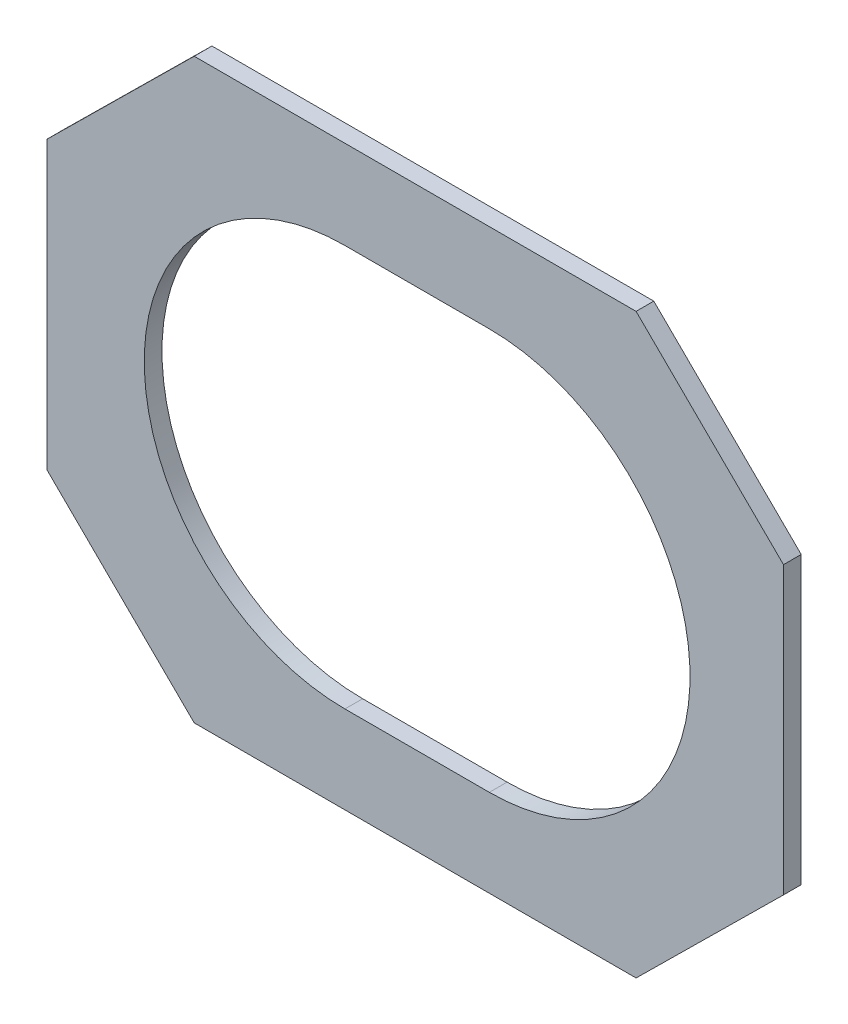
ISO-10303-21;
HEADER;
FILE_DESCRIPTION(('STEP AP214'),'2;1');
FILE_NAME('part.step','',(''),(''),'','','');
FILE_SCHEMA(('AUTOMOTIVE_DESIGN { 1 0 10303 214 1 1 1 1 }'));
ENDSEC;
DATA;
#1=APPLICATION_CONTEXT('core data for automotive mechanical design processes');
#2=APPLICATION_PROTOCOL_DEFINITION('international standard','automotive_design',2000,#1);
#3=PRODUCT_CONTEXT('',#1,'mechanical');
#4=PRODUCT('Part','Part','',(#3));
#5=PRODUCT_RELATED_PRODUCT_CATEGORY('part','',(#4));
#6=PRODUCT_DEFINITION_FORMATION('','',#4);
#7=PRODUCT_DEFINITION_CONTEXT('part definition',#1,'design');
#8=PRODUCT_DEFINITION('design','',#6,#7);
#9=PRODUCT_DEFINITION_SHAPE('','',#8);
#10=(LENGTH_UNIT() NAMED_UNIT(*) SI_UNIT(.MILLI.,.METRE.));
#11=(NAMED_UNIT(*) PLANE_ANGLE_UNIT() SI_UNIT($,.RADIAN.));
#12=(NAMED_UNIT(*) SI_UNIT($,.STERADIAN.) SOLID_ANGLE_UNIT());
#13=UNCERTAINTY_MEASURE_WITH_UNIT(LENGTH_MEASURE(1.E-05),#10,'distance_accuracy_value','');
#14=(GEOMETRIC_REPRESENTATION_CONTEXT(3) GLOBAL_UNCERTAINTY_ASSIGNED_CONTEXT((#13)) GLOBAL_UNIT_ASSIGNED_CONTEXT((#10,
#11,#12)) REPRESENTATION_CONTEXT('',''));
#15=CARTESIAN_POINT('',(0.,0.,0.));
#16=DIRECTION('',(0.,0.,1.));
#17=DIRECTION('',(1.,0.,0.));
#18=AXIS2_PLACEMENT_3D('',#15,#16,#17);
#19=CARTESIAN_POINT('',(0.00469876322514,0.001937867524166,0.1));
#20=DIRECTION('',(0.,0.,1.));
#21=DIRECTION('',(1.,0.,0.));
#22=AXIS2_PLACEMENT_3D('',#19,#20,#21);
#23=PLANE('',#22);
#24=CARTESIAN_POINT('',(-0.396225,0.,0.1));
#25=DIRECTION('',(0.,0.,1.));
#26=DIRECTION('',(1.,0.,0.));
#27=AXIS2_PLACEMENT_3D('',#24,#25,#26);
#28=CIRCLE('',#27,1.133129797124);
#29=CARTESIAN_POINT('',(-0.396225,1.133129797124,0.1));
#30=VERTEX_POINT('',#29);
#31=CARTESIAN_POINT('',(-0.396225,-1.133129797124,0.1));
#32=VERTEX_POINT('',#31);
#33=EDGE_CURVE('E244',#30,#32,#28,.T.);
#34=ORIENTED_EDGE('',*,*,#33,.F.);
#35=DIRECTION('',(-1.,0.,0.));
#36=VECTOR('',#35,1.);
#37=CARTESIAN_POINT('',(0.419316,1.133129797124,0.1));
#38=LINE('',#37,#36);
#39=CARTESIAN_POINT('',(0.419316,1.133129797124,0.1));
#40=VERTEX_POINT('',#39);
#41=EDGE_CURVE('E25',#40,#30,#38,.T.);
#42=ORIENTED_EDGE('',*,*,#41,.F.);
#43=CARTESIAN_POINT('',(0.419316,0.,0.1));
#44=DIRECTION('',(0.,0.,1.));
#45=DIRECTION('',(1.,0.,0.));
#46=AXIS2_PLACEMENT_3D('',#43,#44,#45);
#47=CIRCLE('',#46,1.133129797124);
#48=CARTESIAN_POINT('',(0.419316,-1.133129797124,0.1));
#49=VERTEX_POINT('',#48);
#50=EDGE_CURVE('E262',#49,#40,#47,.T.);
#51=ORIENTED_EDGE('',*,*,#50,.F.);
#52=DIRECTION('',(1.,0.,0.));
#53=VECTOR('',#52,1.);
#54=CARTESIAN_POINT('',(-0.396225,-1.133129797124,0.1));
#55=LINE('',#54,#53);
#56=EDGE_CURVE('E240',#32,#49,#55,.T.);
#57=ORIENTED_EDGE('',*,*,#56,.F.);
#58=EDGE_LOOP('',(#34,#42,#51,#57));
#59=FACE_BOUND('',#58,.T.);
#60=DIRECTION('',(0.,-1.,0.));
#61=VECTOR('',#60,1.);
#62=CARTESIAN_POINT('',(-2.079775000002,0.8107124,0.1));
#63=LINE('',#62,#61);
#64=CARTESIAN_POINT('',(-2.079775000002,0.8107124,0.1));
#65=VERTEX_POINT('',#64);
#66=CARTESIAN_POINT('',(-2.079775000002,-0.804304199997,0.1));
#67=VERTEX_POINT('',#66);
#68=EDGE_CURVE('E160',#65,#67,#63,.T.);
#69=ORIENTED_EDGE('',*,*,#68,.T.);
#70=DIRECTION('',(0.711338653803666,-0.70284942882867,0.));
#71=VECTOR('',#70,1.);
#72=CARTESIAN_POINT('',(-2.079775000002,-0.804304199997,0.1));
#73=LINE('',#72,#71);
#74=CARTESIAN_POINT('',(-1.247349,-1.626795899999,0.1));
#75=VERTEX_POINT('',#74);
#76=EDGE_CURVE('E198',#67,#75,#73,.T.);
#77=ORIENTED_EDGE('',*,*,#76,.T.);
#78=DIRECTION('',(1.,0.,0.));
#79=VECTOR('',#78,1.);
#80=CARTESIAN_POINT('',(-1.247349,-1.626795899999,0.1));
#81=LINE('',#80,#79);
#82=CARTESIAN_POINT('',(1.247799,-1.626795899999,0.1));
#83=VERTEX_POINT('',#82);
#84=EDGE_CURVE('E176',#75,#83,#81,.T.);
#85=ORIENTED_EDGE('',*,*,#84,.T.);
#86=DIRECTION('',(0.711338653802178,0.702849428830176,0.));
#87=VECTOR('',#86,1.);
#88=CARTESIAN_POINT('',(1.247799,-1.626795899999,0.1));
#89=LINE('',#88,#87);
#90=CARTESIAN_POINT('',(2.080224999998,-0.804304199997,0.1));
#91=VERTEX_POINT('',#90);
#92=EDGE_CURVE('E216',#83,#91,#89,.T.);
#93=ORIENTED_EDGE('',*,*,#92,.T.);
#94=DIRECTION('',(0.,1.,0.));
#95=VECTOR('',#94,1.);
#96=CARTESIAN_POINT('',(2.080224999998,-0.804304199997,0.1));
#97=LINE('',#96,#95);
#98=CARTESIAN_POINT('',(2.080224999998,0.8107124,0.1));
#99=VERTEX_POINT('',#98);
#100=EDGE_CURVE('E173',#91,#99,#97,.T.);
#101=ORIENTED_EDGE('',*,*,#100,.T.);
#102=DIRECTION('',(-0.711338653802178,0.702849428830176,0.));
#103=VECTOR('',#102,1.);
#104=CARTESIAN_POINT('',(2.080224999998,0.8107124,0.1));
#105=LINE('',#104,#103);
#106=CARTESIAN_POINT('',(1.247799,1.633204100001,0.1));
#107=VERTEX_POINT('',#106);
#108=EDGE_CURVE('E190',#99,#107,#105,.T.);
#109=ORIENTED_EDGE('',*,*,#108,.T.);
#110=DIRECTION('',(-1.,0.,0.));
#111=VECTOR('',#110,1.);
#112=CARTESIAN_POINT('',(1.247799,1.633204100001,0.1));
#113=LINE('',#112,#111);
#114=CARTESIAN_POINT('',(-1.247349,1.633204100001,0.1));
#115=VERTEX_POINT('',#114);
#116=EDGE_CURVE('E144',#107,#115,#113,.T.);
#117=ORIENTED_EDGE('',*,*,#116,.T.);
#118=DIRECTION('',(-0.711338653803666,-0.70284942882867,0.));
#119=VECTOR('',#118,1.);
#120=CARTESIAN_POINT('',(-1.247349,1.633204100001,0.1));
#121=LINE('',#120,#119);
#122=EDGE_CURVE('E143',#115,#65,#121,.T.);
#123=ORIENTED_EDGE('',*,*,#122,.T.);
#124=EDGE_LOOP('',(#69,#77,#85,#93,#101,#109,#117,#123));
#125=FACE_BOUND('',#124,.T.);
#126=ADVANCED_FACE('F17',(#59,#125),#23,.T.);
#127=CARTESIAN_POINT('',(0.00469876322514,0.001937867524166,0.));
#128=DIRECTION('',(0.,0.,1.));
#129=DIRECTION('',(1.,0.,0.));
#130=AXIS2_PLACEMENT_3D('',#127,#128,#129);
#131=PLANE('',#130);
#132=CARTESIAN_POINT('',(-0.396225,0.,0.));
#133=DIRECTION('',(0.,0.,1.));
#134=DIRECTION('',(1.,0.,0.));
#135=AXIS2_PLACEMENT_3D('',#132,#133,#134);
#136=CIRCLE('',#135,1.133129797124);
#137=CARTESIAN_POINT('',(-0.396225,1.133129797124,0.));
#138=VERTEX_POINT('',#137);
#139=CARTESIAN_POINT('',(-0.396225,-1.133129797124,0.));
#140=VERTEX_POINT('',#139);
#141=EDGE_CURVE('E248',#138,#140,#136,.T.);
#142=ORIENTED_EDGE('',*,*,#141,.T.);
#143=DIRECTION('',(1.,0.,0.));
#144=VECTOR('',#143,1.);
#145=CARTESIAN_POINT('',(-0.396225,-1.133129797124,0.));
#146=LINE('',#145,#144);
#147=CARTESIAN_POINT('',(0.419316,-1.133129797124,0.));
#148=VERTEX_POINT('',#147);
#149=EDGE_CURVE('E239',#140,#148,#146,.T.);
#150=ORIENTED_EDGE('',*,*,#149,.T.);
#151=CARTESIAN_POINT('',(0.419316,0.,0.));
#152=DIRECTION('',(0.,0.,1.));
#153=DIRECTION('',(1.,0.,0.));
#154=AXIS2_PLACEMENT_3D('',#151,#152,#153);
#155=CIRCLE('',#154,1.133129797124);
#156=CARTESIAN_POINT('',(0.419316,1.133129797124,0.));
#157=VERTEX_POINT('',#156);
#158=EDGE_CURVE('E269',#148,#157,#155,.T.);
#159=ORIENTED_EDGE('',*,*,#158,.T.);
#160=DIRECTION('',(-1.,0.,0.));
#161=VECTOR('',#160,1.);
#162=CARTESIAN_POINT('',(0.419316,1.133129797124,0.));
#163=LINE('',#162,#161);
#164=EDGE_CURVE('E11',#157,#138,#163,.T.);
#165=ORIENTED_EDGE('',*,*,#164,.T.);
#166=EDGE_LOOP('',(#142,#150,#159,#165));
#167=FACE_BOUND('',#166,.T.);
#168=DIRECTION('',(0.,-1.,0.));
#169=VECTOR('',#168,1.);
#170=CARTESIAN_POINT('',(-2.079775000002,0.8107124,0.));
#171=LINE('',#170,#169);
#172=CARTESIAN_POINT('',(-2.079775000002,0.8107124,0.));
#173=VERTEX_POINT('',#172);
#174=CARTESIAN_POINT('',(-2.079775000002,-0.804304199997,0.));
#175=VERTEX_POINT('',#174);
#176=EDGE_CURVE('E147',#173,#175,#171,.T.);
#177=ORIENTED_EDGE('',*,*,#176,.F.);
#178=DIRECTION('',(-0.711338653803666,-0.70284942882867,0.));
#179=VECTOR('',#178,1.);
#180=CARTESIAN_POINT('',(-1.247349,1.633204100001,0.));
#181=LINE('',#180,#179);
#182=CARTESIAN_POINT('',(-1.247349,1.633204100001,0.));
#183=VERTEX_POINT('',#182);
#184=EDGE_CURVE('E133',#183,#173,#181,.T.);
#185=ORIENTED_EDGE('',*,*,#184,.F.);
#186=DIRECTION('',(-1.,0.,0.));
#187=VECTOR('',#186,1.);
#188=CARTESIAN_POINT('',(1.247799,1.633204100001,0.));
#189=LINE('',#188,#187);
#190=CARTESIAN_POINT('',(1.247799,1.633204100001,0.));
#191=VERTEX_POINT('',#190);
#192=EDGE_CURVE('E187',#191,#183,#189,.T.);
#193=ORIENTED_EDGE('',*,*,#192,.F.);
#194=DIRECTION('',(-0.711338653802178,0.702849428830176,0.));
#195=VECTOR('',#194,1.);
#196=CARTESIAN_POINT('',(2.080224999998,0.8107124,0.));
#197=LINE('',#196,#195);
#198=CARTESIAN_POINT('',(2.080224999998,0.8107124,0.));
#199=VERTEX_POINT('',#198);
#200=EDGE_CURVE('E220',#199,#191,#197,.T.);
#201=ORIENTED_EDGE('',*,*,#200,.F.);
#202=DIRECTION('',(0.,1.,0.));
#203=VECTOR('',#202,1.);
#204=CARTESIAN_POINT('',(2.080224999998,-0.804304199997,0.));
#205=LINE('',#204,#203);
#206=CARTESIAN_POINT('',(2.080224999998,-0.804304199997,0.));
#207=VERTEX_POINT('',#206);
#208=EDGE_CURVE('E166',#207,#199,#205,.T.);
#209=ORIENTED_EDGE('',*,*,#208,.F.);
#210=DIRECTION('',(0.711338653802178,0.702849428830176,0.));
#211=VECTOR('',#210,1.);
#212=CARTESIAN_POINT('',(1.247799,-1.626795899999,0.));
#213=LINE('',#212,#211);
#214=CARTESIAN_POINT('',(1.247799,-1.626795899999,0.));
#215=VERTEX_POINT('',#214);
#216=EDGE_CURVE('E180',#215,#207,#213,.T.);
#217=ORIENTED_EDGE('',*,*,#216,.F.);
#218=DIRECTION('',(1.,0.,0.));
#219=VECTOR('',#218,1.);
#220=CARTESIAN_POINT('',(-1.247349,-1.626795899999,0.));
#221=LINE('',#220,#219);
#222=CARTESIAN_POINT('',(-1.247349,-1.626795899999,0.));
#223=VERTEX_POINT('',#222);
#224=EDGE_CURVE('E202',#223,#215,#221,.T.);
#225=ORIENTED_EDGE('',*,*,#224,.F.);
#226=DIRECTION('',(0.711338653803666,-0.70284942882867,0.));
#227=VECTOR('',#226,1.);
#228=CARTESIAN_POINT('',(-2.079775000002,-0.804304199997,0.));
#229=LINE('',#228,#227);
#230=EDGE_CURVE('E150',#175,#223,#229,.T.);
#231=ORIENTED_EDGE('',*,*,#230,.F.);
#232=EDGE_LOOP('',(#177,#185,#193,#201,#209,#217,#225,#231));
#233=FACE_BOUND('',#232,.T.);
#234=ADVANCED_FACE('F148',(#167,#233),#131,.F.);
#235=CARTESIAN_POINT('',(0.419316,1.133129797124,0.));
#236=DIRECTION('',(0.,-1.,0.));
#237=DIRECTION('',(0.,0.,-1.));
#238=AXIS2_PLACEMENT_3D('',#235,#236,#237);
#239=PLANE('',#238);
#240=DIRECTION('',(0.,0.,1.));
#241=VECTOR('',#240,1.);
#242=CARTESIAN_POINT('',(0.419316,1.133129797124,0.));
#243=LINE('',#242,#241);
#244=EDGE_CURVE('E266',#157,#40,#243,.T.);
#245=ORIENTED_EDGE('',*,*,#244,.T.);
#246=ORIENTED_EDGE('',*,*,#41,.T.);
#247=DIRECTION('',(0.,0.,1.));
#248=VECTOR('',#247,1.);
#249=CARTESIAN_POINT('',(-0.396225,1.133129797124,0.));
#250=LINE('',#249,#248);
#251=EDGE_CURVE('E234',#138,#30,#250,.T.);
#252=ORIENTED_EDGE('',*,*,#251,.F.);
#253=ORIENTED_EDGE('',*,*,#164,.F.);
#254=EDGE_LOOP('',(#245,#246,#252,#253));
#255=FACE_BOUND('',#254,.T.);
#256=ADVANCED_FACE('F273',(#255),#239,.T.);
#257=CARTESIAN_POINT('',(0.419316,0.,0.));
#258=DIRECTION('',(0.,0.,-1.));
#259=DIRECTION('',(1.,0.,0.));
#260=AXIS2_PLACEMENT_3D('',#257,#258,#259);
#261=CYLINDRICAL_SURFACE('',#260,1.133129797124);
#262=DIRECTION('',(0.,0.,1.));
#263=VECTOR('',#262,1.);
#264=CARTESIAN_POINT('',(0.419316,-1.133129797124,0.));
#265=LINE('',#264,#263);
#266=EDGE_CURVE('E235',#148,#49,#265,.T.);
#267=ORIENTED_EDGE('',*,*,#266,.T.);
#268=ORIENTED_EDGE('',*,*,#50,.T.);
#269=ORIENTED_EDGE('',*,*,#244,.F.);
#270=ORIENTED_EDGE('',*,*,#158,.F.);
#271=EDGE_LOOP('',(#267,#268,#269,#270));
#272=FACE_BOUND('',#271,.T.);
#273=ADVANCED_FACE('F283',(#272),#261,.F.);
#274=CARTESIAN_POINT('',(-0.396225,-1.133129797124,0.));
#275=DIRECTION('',(0.,1.,0.));
#276=DIRECTION('',(1.,0.,0.));
#277=AXIS2_PLACEMENT_3D('',#274,#275,#276);
#278=PLANE('',#277);
#279=DIRECTION('',(0.,0.,1.));
#280=VECTOR('',#279,1.);
#281=CARTESIAN_POINT('',(-0.396225,-1.133129797124,0.));
#282=LINE('',#281,#280);
#283=EDGE_CURVE('E252',#140,#32,#282,.T.);
#284=ORIENTED_EDGE('',*,*,#283,.T.);
#285=ORIENTED_EDGE('',*,*,#56,.T.);
#286=ORIENTED_EDGE('',*,*,#266,.F.);
#287=ORIENTED_EDGE('',*,*,#149,.F.);
#288=EDGE_LOOP('',(#284,#285,#286,#287));
#289=FACE_BOUND('',#288,.T.);
#290=ADVANCED_FACE('F285',(#289),#278,.T.);
#291=CARTESIAN_POINT('',(-0.396225,0.,0.));
#292=DIRECTION('',(0.,0.,-1.));
#293=DIRECTION('',(-1.,0.,0.));
#294=AXIS2_PLACEMENT_3D('',#291,#292,#293);
#295=CYLINDRICAL_SURFACE('',#294,1.133129797124);
#296=ORIENTED_EDGE('',*,*,#251,.T.);
#297=ORIENTED_EDGE('',*,*,#33,.T.);
#298=ORIENTED_EDGE('',*,*,#283,.F.);
#299=ORIENTED_EDGE('',*,*,#141,.F.);
#300=EDGE_LOOP('',(#296,#297,#298,#299));
#301=FACE_BOUND('',#300,.T.);
#302=ADVANCED_FACE('F279',(#301),#295,.F.);
#303=CARTESIAN_POINT('',(-1.247349,1.633204100001,0.));
#304=DIRECTION('',(0.70284942882867,-0.711338653803666,0.));
#305=DIRECTION('',(0.,0.,-1.));
#306=AXIS2_PLACEMENT_3D('',#303,#304,#305);
#307=PLANE('',#306);
#308=DIRECTION('',(0.,0.,1.));
#309=VECTOR('',#308,1.);
#310=CARTESIAN_POINT('',(-1.247349,1.633204100001,0.));
#311=LINE('',#310,#309);
#312=EDGE_CURVE('E139',#183,#115,#311,.T.);
#313=ORIENTED_EDGE('',*,*,#312,.F.);
#314=ORIENTED_EDGE('',*,*,#184,.T.);
#315=DIRECTION('',(0.,0.,1.));
#316=VECTOR('',#315,1.);
#317=CARTESIAN_POINT('',(-2.079775000002,0.8107124,0.));
#318=LINE('',#317,#316);
#319=EDGE_CURVE('E137',#173,#65,#318,.T.);
#320=ORIENTED_EDGE('',*,*,#319,.T.);
#321=ORIENTED_EDGE('',*,*,#122,.F.);
#322=EDGE_LOOP('',(#313,#314,#320,#321));
#323=FACE_BOUND('',#322,.T.);
#324=ADVANCED_FACE('F135',(#323),#307,.F.);
#325=CARTESIAN_POINT('',(1.247799,1.633204100001,0.));
#326=DIRECTION('',(0.,-1.,0.));
#327=DIRECTION('',(0.,0.,-1.));
#328=AXIS2_PLACEMENT_3D('',#325,#326,#327);
#329=PLANE('',#328);
#330=DIRECTION('',(0.,0.,1.));
#331=VECTOR('',#330,1.);
#332=CARTESIAN_POINT('',(1.247799,1.633204100001,0.));
#333=LINE('',#332,#331);
#334=EDGE_CURVE('E194',#191,#107,#333,.T.);
#335=ORIENTED_EDGE('',*,*,#334,.F.);
#336=ORIENTED_EDGE('',*,*,#192,.T.);
#337=ORIENTED_EDGE('',*,*,#312,.T.);
#338=ORIENTED_EDGE('',*,*,#116,.F.);
#339=EDGE_LOOP('',(#335,#336,#337,#338));
#340=FACE_BOUND('',#339,.T.);
#341=ADVANCED_FACE('F307',(#340),#329,.F.);
#342=CARTESIAN_POINT('',(2.080224999998,0.8107124,0.));
#343=DIRECTION('',(-0.702849428830176,-0.711338653802178,0.));
#344=DIRECTION('',(-0.711338653802178,0.702849428830176,0.));
#345=AXIS2_PLACEMENT_3D('',#342,#343,#344);
#346=PLANE('',#345);
#347=DIRECTION('',(0.,0.,1.));
#348=VECTOR('',#347,1.);
#349=CARTESIAN_POINT('',(2.080224999998,0.8107124,0.));
#350=LINE('',#349,#348);
#351=EDGE_CURVE('E169',#199,#99,#350,.T.);
#352=ORIENTED_EDGE('',*,*,#351,.F.);
#353=ORIENTED_EDGE('',*,*,#200,.T.);
#354=ORIENTED_EDGE('',*,*,#334,.T.);
#355=ORIENTED_EDGE('',*,*,#108,.F.);
#356=EDGE_LOOP('',(#352,#353,#354,#355));
#357=FACE_BOUND('',#356,.T.);
#358=ADVANCED_FACE('F308',(#357),#346,.F.);
#359=CARTESIAN_POINT('',(2.080224999998,-0.804304199997,0.));
#360=DIRECTION('',(-1.,0.,0.));
#361=DIRECTION('',(0.,0.,1.));
#362=AXIS2_PLACEMENT_3D('',#359,#360,#361);
#363=PLANE('',#362);
#364=DIRECTION('',(0.,0.,1.));
#365=VECTOR('',#364,1.);
#366=CARTESIAN_POINT('',(2.080224999998,-0.804304199997,0.));
#367=LINE('',#366,#365);
#368=EDGE_CURVE('E212',#207,#91,#367,.T.);
#369=ORIENTED_EDGE('',*,*,#368,.F.);
#370=ORIENTED_EDGE('',*,*,#208,.T.);
#371=ORIENTED_EDGE('',*,*,#351,.T.);
#372=ORIENTED_EDGE('',*,*,#100,.F.);
#373=EDGE_LOOP('',(#369,#370,#371,#372));
#374=FACE_BOUND('',#373,.T.);
#375=ADVANCED_FACE('F310',(#374),#363,.F.);
#376=CARTESIAN_POINT('',(1.247799,-1.626795899999,0.));
#377=DIRECTION('',(-0.702849428830176,0.711338653802178,0.));
#378=DIRECTION('',(0.,0.,1.));
#379=AXIS2_PLACEMENT_3D('',#376,#377,#378);
#380=PLANE('',#379);
#381=DIRECTION('',(0.,0.,1.));
#382=VECTOR('',#381,1.);
#383=CARTESIAN_POINT('',(1.247799,-1.626795899999,0.));
#384=LINE('',#383,#382);
#385=EDGE_CURVE('E181',#215,#83,#384,.T.);
#386=ORIENTED_EDGE('',*,*,#385,.F.);
#387=ORIENTED_EDGE('',*,*,#216,.T.);
#388=ORIENTED_EDGE('',*,*,#368,.T.);
#389=ORIENTED_EDGE('',*,*,#92,.F.);
#390=EDGE_LOOP('',(#386,#387,#388,#389));
#391=FACE_BOUND('',#390,.T.);
#392=ADVANCED_FACE('F316',(#391),#380,.F.);
#393=CARTESIAN_POINT('',(-1.247349,-1.626795899999,0.));
#394=DIRECTION('',(0.,1.,0.));
#395=DIRECTION('',(1.,0.,0.));
#396=AXIS2_PLACEMENT_3D('',#393,#394,#395);
#397=PLANE('',#396);
#398=DIRECTION('',(0.,0.,1.));
#399=VECTOR('',#398,1.);
#400=CARTESIAN_POINT('',(-1.247349,-1.626795899999,0.));
#401=LINE('',#400,#399);
#402=EDGE_CURVE('E186',#223,#75,#401,.T.);
#403=ORIENTED_EDGE('',*,*,#402,.F.);
#404=ORIENTED_EDGE('',*,*,#224,.T.);
#405=ORIENTED_EDGE('',*,*,#385,.T.);
#406=ORIENTED_EDGE('',*,*,#84,.F.);
#407=EDGE_LOOP('',(#403,#404,#405,#406));
#408=FACE_BOUND('',#407,.T.);
#409=ADVANCED_FACE('F333',(#408),#397,.F.);
#410=CARTESIAN_POINT('',(-2.079775000002,-0.804304199997,0.));
#411=DIRECTION('',(0.70284942882867,0.711338653803666,0.));
#412=DIRECTION('',(0.,0.,-1.));
#413=AXIS2_PLACEMENT_3D('',#410,#411,#412);
#414=PLANE('',#413);
#415=DIRECTION('',(0.,0.,1.));
#416=VECTOR('',#415,1.);
#417=CARTESIAN_POINT('',(-2.079775000002,-0.804304199997,0.));
#418=LINE('',#417,#416);
#419=EDGE_CURVE('E155',#175,#67,#418,.T.);
#420=ORIENTED_EDGE('',*,*,#419,.F.);
#421=ORIENTED_EDGE('',*,*,#230,.T.);
#422=ORIENTED_EDGE('',*,*,#402,.T.);
#423=ORIENTED_EDGE('',*,*,#76,.F.);
#424=EDGE_LOOP('',(#420,#421,#422,#423));
#425=FACE_BOUND('',#424,.T.);
#426=ADVANCED_FACE('F335',(#425),#414,.F.);
#427=CARTESIAN_POINT('',(-2.079775000002,0.8107124,0.));
#428=DIRECTION('',(1.,0.,0.));
#429=DIRECTION('',(0.,1.,0.));
#430=AXIS2_PLACEMENT_3D('',#427,#428,#429);
#431=PLANE('',#430);
#432=ORIENTED_EDGE('',*,*,#319,.F.);
#433=ORIENTED_EDGE('',*,*,#176,.T.);
#434=ORIENTED_EDGE('',*,*,#419,.T.);
#435=ORIENTED_EDGE('',*,*,#68,.F.);
#436=EDGE_LOOP('',(#432,#433,#434,#435));
#437=FACE_BOUND('',#436,.T.);
#438=ADVANCED_FACE('F158',(#437),#431,.F.);
#439=CLOSED_SHELL('',(#126,#234,#256,#273,#290,#302,#324,#341,#358,#375,#392,#409,#426,#438));
#440=MANIFOLD_SOLID_BREP('B1',#439);
#441=ADVANCED_BREP_SHAPE_REPRESENTATION('',(#18,#440),#14);
#442=SHAPE_DEFINITION_REPRESENTATION(#9,#441);
ENDSEC;
END-ISO-10303-21;
